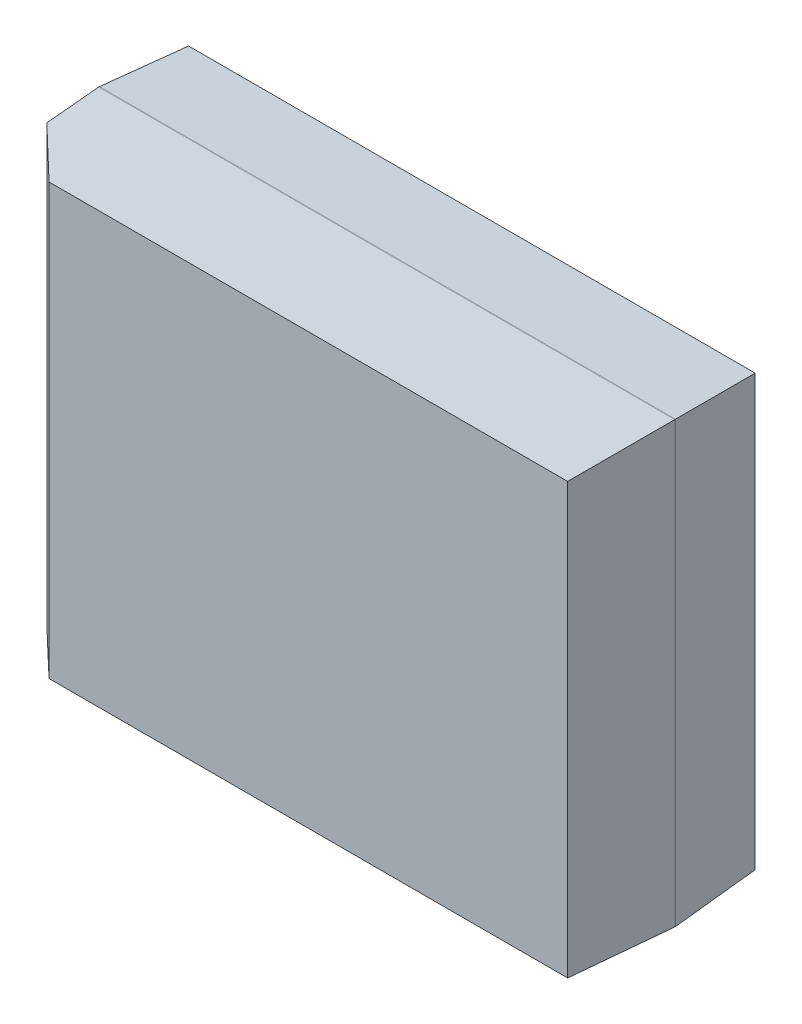
ISO-10303-21;
HEADER;
FILE_DESCRIPTION(('STEP AP214'),'2;1');
FILE_NAME('part.step','',(''),(''),'','','');
FILE_SCHEMA(('AUTOMOTIVE_DESIGN { 1 0 10303 214 1 1 1 1 }'));
ENDSEC;
DATA;
#1=APPLICATION_CONTEXT('core data for automotive mechanical design processes');
#2=APPLICATION_PROTOCOL_DEFINITION('international standard','automotive_design',2000,#1);
#3=PRODUCT_CONTEXT('',#1,'mechanical');
#4=PRODUCT('Part','Part','',(#3));
#5=PRODUCT_RELATED_PRODUCT_CATEGORY('part','',(#4));
#6=PRODUCT_DEFINITION_FORMATION('','',#4);
#7=PRODUCT_DEFINITION_CONTEXT('part definition',#1,'design');
#8=PRODUCT_DEFINITION('design','',#6,#7);
#9=PRODUCT_DEFINITION_SHAPE('','',#8);
#10=(LENGTH_UNIT() NAMED_UNIT(*) SI_UNIT(.MILLI.,.METRE.));
#11=(NAMED_UNIT(*) PLANE_ANGLE_UNIT() SI_UNIT($,.RADIAN.));
#12=(NAMED_UNIT(*) SI_UNIT($,.STERADIAN.) SOLID_ANGLE_UNIT());
#13=UNCERTAINTY_MEASURE_WITH_UNIT(LENGTH_MEASURE(1.E-05),#10,'distance_accuracy_value','');
#14=(GEOMETRIC_REPRESENTATION_CONTEXT(3) GLOBAL_UNCERTAINTY_ASSIGNED_CONTEXT((#13)) GLOBAL_UNIT_ASSIGNED_CONTEXT((#10,
#11,#12)) REPRESENTATION_CONTEXT('',''));
#15=CARTESIAN_POINT('',(0.,0.,0.));
#16=DIRECTION('',(0.,0.,1.));
#17=DIRECTION('',(1.,0.,0.));
#18=AXIS2_PLACEMENT_3D('',#15,#16,#17);
#19=CARTESIAN_POINT('',(-3.499250173027,-2.8895,2.297837490704));
#20=DIRECTION('',(0.690747069980294,0.,-0.723096456438308));
#21=DIRECTION('',(-0.723096456438308,0.,-0.690747069980294));
#22=AXIS2_PLACEMENT_3D('',#19,#20,#21);
#23=PLANE('',#22);
#24=DIRECTION('',(0.722735110699083,-0.0316099702489902,0.690401889875486));
#25=VECTOR('',#24,1.);
#26=CARTESIAN_POINT('',(-3.83650034605434,2.919000346055,1.97567498140831));
#27=LINE('',#26,#25);
#28=CARTESIAN_POINT('',(-3.83650034605459,2.91900034605492,1.97567498140865));
#29=VERTEX_POINT('',#28);
#30=CARTESIAN_POINT('',(-3.16199999999984,2.8895,2.61999999999983));
#31=VERTEX_POINT('',#30);
#32=EDGE_CURVE('E94',#29,#31,#27,.T.);
#33=ORIENTED_EDGE('',*,*,#32,.F.);
#34=DIRECTION('',(0.,1.,0.));
#35=VECTOR('',#34,1.);
#36=CARTESIAN_POINT('',(-3.83650034605468,-2.9525,1.97567498140899));
#37=LINE('',#36,#35);
#38=CARTESIAN_POINT('',(-3.83650034605459,-2.91900034605492,1.97567498140865));
#39=VERTEX_POINT('',#38);
#40=EDGE_CURVE('E92',#29,#39,#37,.F.);
#41=ORIENTED_EDGE('',*,*,#40,.T.);
#42=DIRECTION('',(-0.722735110699083,-0.0316099702489902,-0.690401889875486));
#43=VECTOR('',#42,1.);
#44=CARTESIAN_POINT('',(-3.16199999999968,-2.8895,2.61999999999967));
#45=LINE('',#44,#43);
#46=CARTESIAN_POINT('',(-3.16199999999984,-2.8895,2.61999999999983));
#47=VERTEX_POINT('',#46);
#48=EDGE_CURVE('E20',#47,#39,#45,.T.);
#49=ORIENTED_EDGE('',*,*,#48,.F.);
#50=DIRECTION('',(0.,1.,0.));
#51=VECTOR('',#50,1.);
#52=CARTESIAN_POINT('',(-3.162,-2.9525,2.62));
#53=LINE('',#52,#51);
#54=EDGE_CURVE('E89',#31,#47,#53,.F.);
#55=ORIENTED_EDGE('',*,*,#54,.F.);
#56=EDGE_LOOP('',(#33,#41,#49,#55));
#57=FACE_BOUND('',#56,.T.);
#58=ADVANCED_FACE('F17',(#57),#23,.F.);
#59=CARTESIAN_POINT('',(-3.87,-2.9525,2.62));
#60=DIRECTION('',(0.,0.,1.));
#61=DIRECTION('',(1.,0.,0.));
#62=AXIS2_PLACEMENT_3D('',#59,#60,#61);
#63=PLANE('',#62);
#64=DIRECTION('',(1.,0.,0.));
#65=VECTOR('',#64,1.);
#66=CARTESIAN_POINT('',(-3.87,2.88950000000002,2.62));
#67=LINE('',#66,#65);
#68=CARTESIAN_POINT('',(3.807,2.8895,2.62));
#69=VERTEX_POINT('',#68);
#70=EDGE_CURVE('E100',#31,#69,#67,.T.);
#71=ORIENTED_EDGE('',*,*,#70,.F.);
#72=ORIENTED_EDGE('',*,*,#54,.T.);
#73=DIRECTION('',(1.,0.,0.));
#74=VECTOR('',#73,1.);
#75=CARTESIAN_POINT('',(-3.87,-2.88950000000002,2.62));
#76=LINE('',#75,#74);
#77=CARTESIAN_POINT('',(3.807,-2.88950000000001,2.62));
#78=VERTEX_POINT('',#77);
#79=EDGE_CURVE('E98',#47,#78,#76,.T.);
#80=ORIENTED_EDGE('',*,*,#79,.T.);
#81=DIRECTION('',(0.,1.,0.));
#82=VECTOR('',#81,1.);
#83=CARTESIAN_POINT('',(3.80700000000002,-2.9525,2.62));
#84=LINE('',#83,#82);
#85=EDGE_CURVE('E155',#69,#78,#84,.F.);
#86=ORIENTED_EDGE('',*,*,#85,.F.);
#87=EDGE_LOOP('',(#71,#72,#80,#86));
#88=FACE_BOUND('',#87,.T.);
#89=ADVANCED_FACE('F96',(#88),#63,.T.);
#90=CARTESIAN_POINT('',(-3.8385,-2.9525,1.932));
#91=DIRECTION('',(0.998953517195784,0.,-0.0457369706274001));
#92=DIRECTION('',(-0.0457369706274001,0.,-0.998953517195784));
#93=AXIS2_PLACEMENT_3D('',#90,#91,#92);
#94=PLANE('',#93);
#95=DIRECTION('',(0.0456892076400203,-0.0456892076404391,0.997910312909139));
#96=VECTOR('',#95,1.);
#97=CARTESIAN_POINT('',(-3.87,2.95249999999998,1.244));
#98=LINE('',#97,#96);
#99=CARTESIAN_POINT('',(-3.86999999999999,2.9525,1.244));
#100=VERTEX_POINT('',#99);
#101=EDGE_CURVE('E116',#100,#29,#98,.T.);
#102=ORIENTED_EDGE('',*,*,#101,.F.);
#103=DIRECTION('',(0.,1.,0.));
#104=VECTOR('',#103,1.);
#105=CARTESIAN_POINT('',(-3.87,-2.9525,1.244));
#106=LINE('',#105,#104);
#107=CARTESIAN_POINT('',(-3.86999999999999,-2.9525,1.244));
#108=VERTEX_POINT('',#107);
#109=EDGE_CURVE('E120',#100,#108,#106,.F.);
#110=ORIENTED_EDGE('',*,*,#109,.T.);
#111=DIRECTION('',(0.0456892076400203,0.0456892076404391,0.997910312909139));
#112=VECTOR('',#111,1.);
#113=CARTESIAN_POINT('',(-3.87,-2.95249999999998,1.244));
#114=LINE('',#113,#112);
#115=EDGE_CURVE('E106',#108,#39,#114,.T.);
#116=ORIENTED_EDGE('',*,*,#115,.T.);
#117=ORIENTED_EDGE('',*,*,#40,.F.);
#118=EDGE_LOOP('',(#102,#110,#116,#117));
#119=FACE_BOUND('',#118,.T.);
#120=ADVANCED_FACE('F118',(#119),#94,.F.);
#121=CARTESIAN_POINT('',(-3.87,-2.921,1.932));
#122=DIRECTION('',(0.,0.998953517195784,-0.0457369706274001));
#123=DIRECTION('',(0.,0.0457369706274001,0.998953517195784));
#124=AXIS2_PLACEMENT_3D('',#121,#122,#123);
#125=PLANE('',#124);
#126=DIRECTION('',(1.,0.,0.));
#127=VECTOR('',#126,1.);
#128=CARTESIAN_POINT('',(-3.87,-2.9525,1.244));
#129=LINE('',#128,#127);
#130=CARTESIAN_POINT('',(3.87,-2.95249999999999,1.244));
#131=VERTEX_POINT('',#130);
#132=EDGE_CURVE('E122',#108,#131,#129,.T.);
#133=ORIENTED_EDGE('',*,*,#132,.T.);
#134=DIRECTION('',(0.0456892076404382,-0.0456892076404611,-0.997910312909119));
#135=VECTOR('',#134,1.);
#136=CARTESIAN_POINT('',(3.80700000000002,-2.8895,2.62));
#137=LINE('',#136,#135);
#138=EDGE_CURVE('E105',#78,#131,#137,.T.);
#139=ORIENTED_EDGE('',*,*,#138,.F.);
#140=ORIENTED_EDGE('',*,*,#79,.F.);
#141=ORIENTED_EDGE('',*,*,#48,.T.);
#142=ORIENTED_EDGE('',*,*,#115,.F.);
#143=EDGE_LOOP('',(#133,#139,#140,#141,#142));
#144=FACE_BOUND('',#143,.T.);
#145=ADVANCED_FACE('F104',(#144),#125,.F.);
#146=CARTESIAN_POINT('',(3.8385,-2.9525,1.932));
#147=DIRECTION('',(0.998953517195784,0.,0.0457369706274001));
#148=DIRECTION('',(0.0457369706274001,0.,-0.998953517195784));
#149=AXIS2_PLACEMENT_3D('',#146,#147,#148);
#150=PLANE('',#149);
#151=DIRECTION('',(0.0456892076404615,0.0456892076404382,-0.997910312909119));
#152=VECTOR('',#151,1.);
#153=CARTESIAN_POINT('',(3.807,2.88950000000002,2.62));
#154=LINE('',#153,#152);
#155=CARTESIAN_POINT('',(3.86999999999999,2.9525,1.244));
#156=VERTEX_POINT('',#155);
#157=EDGE_CURVE('E152',#69,#156,#154,.T.);
#158=ORIENTED_EDGE('',*,*,#157,.F.);
#159=ORIENTED_EDGE('',*,*,#85,.T.);
#160=ORIENTED_EDGE('',*,*,#138,.T.);
#161=DIRECTION('',(0.,1.,0.));
#162=VECTOR('',#161,1.);
#163=CARTESIAN_POINT('',(3.87,-2.9525,1.244));
#164=LINE('',#163,#162);
#165=EDGE_CURVE('E133',#156,#131,#164,.F.);
#166=ORIENTED_EDGE('',*,*,#165,.F.);
#167=EDGE_LOOP('',(#158,#159,#160,#166));
#168=FACE_BOUND('',#167,.T.);
#169=ADVANCED_FACE('F156',(#168),#150,.T.);
#170=CARTESIAN_POINT('',(-3.87,2.921,1.932));
#171=DIRECTION('',(0.,0.998953517195784,0.0457369706274001));
#172=DIRECTION('',(0.,-0.0457369706274001,0.998953517195784));
#173=AXIS2_PLACEMENT_3D('',#170,#171,#172);
#174=PLANE('',#173);
#175=DIRECTION('',(1.,0.,0.));
#176=VECTOR('',#175,1.);
#177=CARTESIAN_POINT('',(-3.87,2.9525,1.244));
#178=LINE('',#177,#176);
#179=EDGE_CURVE('E157',#100,#156,#178,.T.);
#180=ORIENTED_EDGE('',*,*,#179,.F.);
#181=ORIENTED_EDGE('',*,*,#101,.T.);
#182=ORIENTED_EDGE('',*,*,#32,.T.);
#183=ORIENTED_EDGE('',*,*,#70,.T.);
#184=ORIENTED_EDGE('',*,*,#157,.T.);
#185=EDGE_LOOP('',(#180,#181,#182,#183,#184));
#186=FACE_BOUND('',#185,.T.);
#187=ADVANCED_FACE('F114',(#186),#174,.T.);
#188=CARTESIAN_POINT('',(-3.87,-2.9525,0.1));
#189=DIRECTION('',(1.,0.,0.));
#190=DIRECTION('',(0.,0.,-1.));
#191=AXIS2_PLACEMENT_3D('',#188,#189,#190);
#192=PLANE('',#191);
#193=DIRECTION('',(0.,0.,1.));
#194=VECTOR('',#193,1.);
#195=CARTESIAN_POINT('',(-3.87,2.9525,0.1));
#196=LINE('',#195,#194);
#197=CARTESIAN_POINT('',(-3.87,2.9525,1.234));
#198=VERTEX_POINT('',#197);
#199=EDGE_CURVE('E161',#198,#100,#196,.T.);
#200=ORIENTED_EDGE('',*,*,#199,.F.);
#201=DIRECTION('',(0.,1.,0.));
#202=VECTOR('',#201,1.);
#203=CARTESIAN_POINT('',(-3.87000000000002,-2.9525,1.234));
#204=LINE('',#203,#202);
#205=CARTESIAN_POINT('',(-3.87,-2.9525,1.234));
#206=VERTEX_POINT('',#205);
#207=EDGE_CURVE('E160',#206,#198,#204,.T.);
#208=ORIENTED_EDGE('',*,*,#207,.F.);
#209=DIRECTION('',(0.,0.,1.));
#210=VECTOR('',#209,1.);
#211=CARTESIAN_POINT('',(-3.87,-2.9525,0.1));
#212=LINE('',#211,#210);
#213=EDGE_CURVE('E128',#206,#108,#212,.T.);
#214=ORIENTED_EDGE('',*,*,#213,.T.);
#215=ORIENTED_EDGE('',*,*,#109,.F.);
#216=EDGE_LOOP('',(#200,#208,#214,#215));
#217=FACE_BOUND('',#216,.T.);
#218=ADVANCED_FACE('F195',(#217),#192,.F.);
#219=CARTESIAN_POINT('',(-3.87,-2.9525,0.1));
#220=DIRECTION('',(0.,1.,0.));
#221=DIRECTION('',(0.,0.,1.));
#222=AXIS2_PLACEMENT_3D('',#219,#220,#221);
#223=PLANE('',#222);
#224=ORIENTED_EDGE('',*,*,#213,.F.);
#225=DIRECTION('',(1.,0.,0.));
#226=VECTOR('',#225,1.);
#227=CARTESIAN_POINT('',(-3.87,-2.95250000000002,1.234));
#228=LINE('',#227,#226);
#229=CARTESIAN_POINT('',(3.87,-2.95250000000001,1.234));
#230=VERTEX_POINT('',#229);
#231=EDGE_CURVE('E144',#230,#206,#228,.F.);
#232=ORIENTED_EDGE('',*,*,#231,.F.);
#233=DIRECTION('',(0.,0.,-1.));
#234=VECTOR('',#233,1.);
#235=CARTESIAN_POINT('',(3.87,-2.9525,0.1));
#236=LINE('',#235,#234);
#237=EDGE_CURVE('E127',#131,#230,#236,.T.);
#238=ORIENTED_EDGE('',*,*,#237,.F.);
#239=ORIENTED_EDGE('',*,*,#132,.F.);
#240=EDGE_LOOP('',(#224,#232,#238,#239));
#241=FACE_BOUND('',#240,.T.);
#242=ADVANCED_FACE('F142',(#241),#223,.F.);
#243=CARTESIAN_POINT('',(3.87,-2.9525,0.1));
#244=DIRECTION('',(1.,0.,0.));
#245=DIRECTION('',(0.,0.,-1.));
#246=AXIS2_PLACEMENT_3D('',#243,#244,#245);
#247=PLANE('',#246);
#248=DIRECTION('',(0.,0.,1.));
#249=VECTOR('',#248,1.);
#250=CARTESIAN_POINT('',(3.87,2.9525,0.1));
#251=LINE('',#250,#249);
#252=CARTESIAN_POINT('',(3.87000000000001,2.9525,1.234));
#253=VERTEX_POINT('',#252);
#254=EDGE_CURVE('E137',#156,#253,#251,.F.);
#255=ORIENTED_EDGE('',*,*,#254,.F.);
#256=ORIENTED_EDGE('',*,*,#165,.T.);
#257=ORIENTED_EDGE('',*,*,#237,.T.);
#258=DIRECTION('',(0.,1.,0.));
#259=VECTOR('',#258,1.);
#260=CARTESIAN_POINT('',(3.87000000000002,-2.9525,1.234));
#261=LINE('',#260,#259);
#262=EDGE_CURVE('E169',#230,#253,#261,.T.);
#263=ORIENTED_EDGE('',*,*,#262,.T.);
#264=EDGE_LOOP('',(#255,#256,#257,#263));
#265=FACE_BOUND('',#264,.T.);
#266=ADVANCED_FACE('F134',(#265),#247,.T.);
#267=CARTESIAN_POINT('',(-3.87,2.9525,0.1));
#268=DIRECTION('',(0.,1.,0.));
#269=DIRECTION('',(0.,0.,1.));
#270=AXIS2_PLACEMENT_3D('',#267,#268,#269);
#271=PLANE('',#270);
#272=ORIENTED_EDGE('',*,*,#199,.T.);
#273=ORIENTED_EDGE('',*,*,#179,.T.);
#274=ORIENTED_EDGE('',*,*,#254,.T.);
#275=DIRECTION('',(1.,0.,0.));
#276=VECTOR('',#275,1.);
#277=CARTESIAN_POINT('',(-3.87,2.95250000000002,1.234));
#278=LINE('',#277,#276);
#279=EDGE_CURVE('E168',#253,#198,#278,.F.);
#280=ORIENTED_EDGE('',*,*,#279,.T.);
#281=EDGE_LOOP('',(#272,#273,#274,#280));
#282=FACE_BOUND('',#281,.T.);
#283=ADVANCED_FACE('F167',(#282),#271,.T.);
#284=CARTESIAN_POINT('',(-3.8385,-2.9525,0.667));
#285=DIRECTION('',(-0.99846035320541,0.,-0.0554700196225628));
#286=DIRECTION('',(-0.0554700196225628,0.,0.99846035320541));
#287=AXIS2_PLACEMENT_3D('',#284,#285,#286);
#288=PLANE('',#287);
#289=DIRECTION('',(0.0553848775621712,-0.0553848775622113,-0.996927796119078));
#290=VECTOR('',#289,1.);
#291=CARTESIAN_POINT('',(-3.87,2.95250000000002,1.234));
#292=LINE('',#291,#290);
#293=CARTESIAN_POINT('',(-3.80699999999999,2.88949999999999,0.100000000000001));
#294=VERTEX_POINT('',#293);
#295=EDGE_CURVE('E177',#198,#294,#292,.T.);
#296=ORIENTED_EDGE('',*,*,#295,.T.);
#297=DIRECTION('',(0.,1.,0.));
#298=VECTOR('',#297,1.);
#299=CARTESIAN_POINT('',(-3.807,-2.9525,0.1));
#300=LINE('',#299,#298);
#301=CARTESIAN_POINT('',(-3.80699999999999,-2.88949999999999,0.100000000000001));
#302=VERTEX_POINT('',#301);
#303=EDGE_CURVE('E199',#294,#302,#300,.F.);
#304=ORIENTED_EDGE('',*,*,#303,.T.);
#305=DIRECTION('',(0.0553848775621712,0.0553848775622113,-0.996927796119078));
#306=VECTOR('',#305,1.);
#307=CARTESIAN_POINT('',(-3.87,-2.95250000000002,1.234));
#308=LINE('',#307,#306);
#309=EDGE_CURVE('E186',#206,#302,#308,.T.);
#310=ORIENTED_EDGE('',*,*,#309,.F.);
#311=ORIENTED_EDGE('',*,*,#207,.T.);
#312=EDGE_LOOP('',(#296,#304,#310,#311));
#313=FACE_BOUND('',#312,.T.);
#314=ADVANCED_FACE('F198',(#313),#288,.T.);
#315=CARTESIAN_POINT('',(-3.87,-2.921,0.667));
#316=DIRECTION('',(0.,-0.99846035320541,-0.0554700196225628));
#317=DIRECTION('',(0.,0.0554700196225628,-0.99846035320541));
#318=AXIS2_PLACEMENT_3D('',#315,#316,#317);
#319=PLANE('',#318);
#320=ORIENTED_EDGE('',*,*,#231,.T.);
#321=ORIENTED_EDGE('',*,*,#309,.T.);
#322=DIRECTION('',(1.,0.,0.));
#323=VECTOR('',#322,1.);
#324=CARTESIAN_POINT('',(-3.87,-2.8895,0.1));
#325=LINE('',#324,#323);
#326=CARTESIAN_POINT('',(3.80699999999999,-2.88949999999999,0.100000000000001));
#327=VERTEX_POINT('',#326);
#328=EDGE_CURVE('E201',#302,#327,#325,.T.);
#329=ORIENTED_EDGE('',*,*,#328,.T.);
#330=DIRECTION('',(0.0553848775622113,-0.0553848775621712,0.996927796119078));
#331=VECTOR('',#330,1.);
#332=CARTESIAN_POINT('',(3.80699999999998,-2.8895,0.100000000000001));
#333=LINE('',#332,#331);
#334=EDGE_CURVE('E172',#327,#230,#333,.T.);
#335=ORIENTED_EDGE('',*,*,#334,.T.);
#336=EDGE_LOOP('',(#320,#321,#329,#335));
#337=FACE_BOUND('',#336,.T.);
#338=ADVANCED_FACE('F189',(#337),#319,.T.);
#339=CARTESIAN_POINT('',(3.8385,-2.9525,0.667));
#340=DIRECTION('',(-0.99846035320541,0.,0.0554700196225628));
#341=DIRECTION('',(0.0554700196225628,0.,0.99846035320541));
#342=AXIS2_PLACEMENT_3D('',#339,#340,#341);
#343=PLANE('',#342);
#344=DIRECTION('',(0.0553848775621716,0.0553848775622113,0.996927796119078));
#345=VECTOR('',#344,1.);
#346=CARTESIAN_POINT('',(3.807,2.88949999999998,0.100000000000001));
#347=LINE('',#346,#345);
#348=CARTESIAN_POINT('',(3.80699999999999,2.88949999999999,0.100000000000001));
#349=VERTEX_POINT('',#348);
#350=EDGE_CURVE('E34',#349,#253,#347,.T.);
#351=ORIENTED_EDGE('',*,*,#350,.T.);
#352=ORIENTED_EDGE('',*,*,#262,.F.);
#353=ORIENTED_EDGE('',*,*,#334,.F.);
#354=DIRECTION('',(0.,1.,0.));
#355=VECTOR('',#354,1.);
#356=CARTESIAN_POINT('',(3.807,-2.9525,0.1));
#357=LINE('',#356,#355);
#358=EDGE_CURVE('E26',#327,#349,#357,.T.);
#359=ORIENTED_EDGE('',*,*,#358,.T.);
#360=EDGE_LOOP('',(#351,#352,#353,#359));
#361=FACE_BOUND('',#360,.T.);
#362=ADVANCED_FACE('F180',(#361),#343,.F.);
#363=CARTESIAN_POINT('',(-3.87,2.921,0.667));
#364=DIRECTION('',(0.,-0.99846035320541,0.0554700196225628));
#365=DIRECTION('',(0.,-0.0554700196225628,-0.99846035320541));
#366=AXIS2_PLACEMENT_3D('',#363,#364,#365);
#367=PLANE('',#366);
#368=ORIENTED_EDGE('',*,*,#279,.F.);
#369=ORIENTED_EDGE('',*,*,#350,.F.);
#370=DIRECTION('',(1.,0.,0.));
#371=VECTOR('',#370,1.);
#372=CARTESIAN_POINT('',(-3.87,2.8895,0.1));
#373=LINE('',#372,#371);
#374=EDGE_CURVE('E11',#349,#294,#373,.F.);
#375=ORIENTED_EDGE('',*,*,#374,.T.);
#376=ORIENTED_EDGE('',*,*,#295,.F.);
#377=EDGE_LOOP('',(#368,#369,#375,#376));
#378=FACE_BOUND('',#377,.T.);
#379=ADVANCED_FACE('F175',(#378),#367,.F.);
#380=CARTESIAN_POINT('',(-3.87,-2.9525,0.1));
#381=DIRECTION('',(0.,0.,1.));
#382=DIRECTION('',(1.,0.,0.));
#383=AXIS2_PLACEMENT_3D('',#380,#381,#382);
#384=PLANE('',#383);
#385=ORIENTED_EDGE('',*,*,#358,.F.);
#386=ORIENTED_EDGE('',*,*,#328,.F.);
#387=ORIENTED_EDGE('',*,*,#303,.F.);
#388=ORIENTED_EDGE('',*,*,#374,.F.);
#389=EDGE_LOOP('',(#385,#386,#387,#388));
#390=FACE_BOUND('',#389,.T.);
#391=ADVANCED_FACE('F205',(#390),#384,.F.);
#392=CLOSED_SHELL('',(#58,#89,#120,#145,#169,#187,#218,#242,#266,#283,#314,#338,#362,#379,#391));
#393=MANIFOLD_SOLID_BREP('B1',#392);
#394=ADVANCED_BREP_SHAPE_REPRESENTATION('',(#18,#393),#14);
#395=SHAPE_DEFINITION_REPRESENTATION(#9,#394);
ENDSEC;
END-ISO-10303-21;
